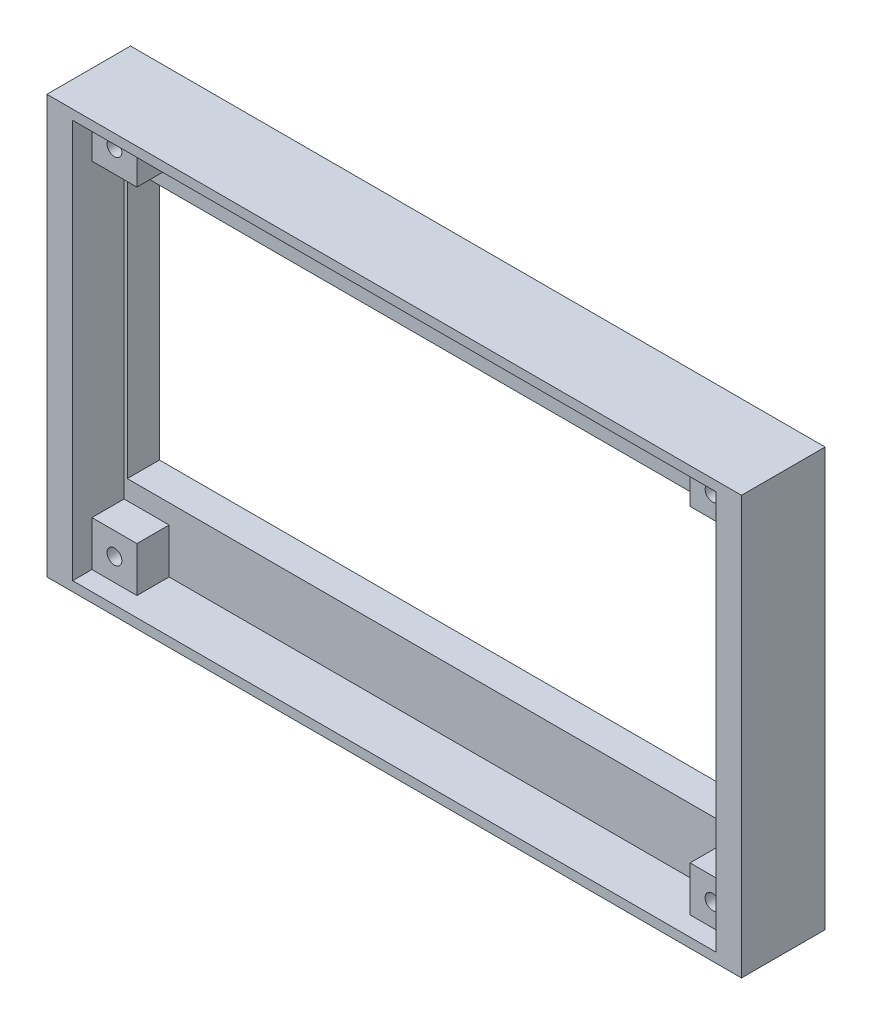
ISO-10303-21;
HEADER;
FILE_DESCRIPTION(('STEP AP214'),'2;1');
FILE_NAME('part.step','',(''),(''),'','','');
FILE_SCHEMA(('AUTOMOTIVE_DESIGN { 1 0 10303 214 1 1 1 1 }'));
ENDSEC;
DATA;
#1=APPLICATION_CONTEXT('core data for automotive mechanical design processes');
#2=APPLICATION_PROTOCOL_DEFINITION('international standard','automotive_design',2000,#1);
#3=PRODUCT_CONTEXT('',#1,'mechanical');
#4=PRODUCT('Part','Part','',(#3));
#5=PRODUCT_RELATED_PRODUCT_CATEGORY('part','',(#4));
#6=PRODUCT_DEFINITION_FORMATION('','',#4);
#7=PRODUCT_DEFINITION_CONTEXT('part definition',#1,'design');
#8=PRODUCT_DEFINITION('design','',#6,#7);
#9=PRODUCT_DEFINITION_SHAPE('','',#8);
#10=(LENGTH_UNIT() NAMED_UNIT(*) SI_UNIT(.MILLI.,.METRE.));
#11=(NAMED_UNIT(*) PLANE_ANGLE_UNIT() SI_UNIT($,.RADIAN.));
#12=(NAMED_UNIT(*) SI_UNIT($,.STERADIAN.) SOLID_ANGLE_UNIT());
#13=UNCERTAINTY_MEASURE_WITH_UNIT(LENGTH_MEASURE(1.E-05),#10,'distance_accuracy_value','');
#14=(GEOMETRIC_REPRESENTATION_CONTEXT(3) GLOBAL_UNCERTAINTY_ASSIGNED_CONTEXT((#13)) GLOBAL_UNIT_ASSIGNED_CONTEXT((#10,
#11,#12)) REPRESENTATION_CONTEXT('',''));
#15=CARTESIAN_POINT('',(0.,0.,0.));
#16=DIRECTION('',(0.,0.,1.));
#17=DIRECTION('',(1.,0.,0.));
#18=AXIS2_PLACEMENT_3D('',#15,#16,#17);
#19=CARTESIAN_POINT('',(0.,0.,10.));
#20=DIRECTION('',(0.,0.,1.));
#21=DIRECTION('',(1.,0.,0.));
#22=AXIS2_PLACEMENT_3D('',#19,#20,#21);
#23=PLANE('',#22);
#24=CARTESIAN_POINT('',(57.0752065679016,-33.9701789264413,10.));
#25=DIRECTION('',(0.,0.,1.));
#26=DIRECTION('',(1.,0.,0.));
#27=AXIS2_PLACEMENT_3D('',#24,#25,#26);
#28=CIRCLE('',#27,1.15);
#29=CARTESIAN_POINT('',(58.2252065679016,-33.9701789264413,10.));
#30=VERTEX_POINT('',#29);
#31=EDGE_CURVE('E558',#30,#30,#28,.T.);
#32=ORIENTED_EDGE('',*,*,#31,.F.);
#33=EDGE_LOOP('',(#32));
#34=FACE_BOUND('',#33,.T.);
#35=DIRECTION('',(0.,1.,0.));
#36=VECTOR('',#35,1.);
#37=CARTESIAN_POINT('',(53.5752065679016,0.,10.));
#38=LINE('',#37,#36);
#39=CARTESIAN_POINT('',(53.5752065679016,-37.4701789264413,10.));
#40=VERTEX_POINT('',#39);
#41=CARTESIAN_POINT('',(53.5752065679016,-30.4701789264413,10.));
#42=VERTEX_POINT('',#41);
#43=EDGE_CURVE('E290',#40,#42,#38,.T.);
#44=ORIENTED_EDGE('',*,*,#43,.F.);
#45=DIRECTION('',(1.,0.,0.));
#46=VECTOR('',#45,1.);
#47=CARTESIAN_POINT('',(0.,-37.4701789264413,10.));
#48=LINE('',#47,#46);
#49=CARTESIAN_POINT('',(60.5752065679016,-37.4701789264413,10.));
#50=VERTEX_POINT('',#49);
#51=EDGE_CURVE('E11',#40,#50,#48,.T.);
#52=ORIENTED_EDGE('',*,*,#51,.T.);
#53=DIRECTION('',(0.,1.,0.));
#54=VECTOR('',#53,1.);
#55=CARTESIAN_POINT('',(60.5752065679016,0.,10.));
#56=LINE('',#55,#54);
#57=CARTESIAN_POINT('',(60.5752065679016,-30.4701789264413,10.));
#58=VERTEX_POINT('',#57);
#59=EDGE_CURVE('E225',#50,#58,#56,.T.);
#60=ORIENTED_EDGE('',*,*,#59,.T.);
#61=DIRECTION('',(-1.,0.,0.));
#62=VECTOR('',#61,1.);
#63=CARTESIAN_POINT('',(0.,-30.4701789264413,10.));
#64=LINE('',#63,#62);
#65=EDGE_CURVE('E287',#58,#42,#64,.T.);
#66=ORIENTED_EDGE('',*,*,#65,.T.);
#67=EDGE_LOOP('',(#44,#52,#60,#66));
#68=FACE_BOUND('',#67,.T.);
#69=ADVANCED_FACE('F41',(#34,#68),#23,.T.);
#70=CARTESIAN_POINT('',(57.0752065679016,21.0298210735587,10.));
#71=DIRECTION('',(0.,0.,1.));
#72=DIRECTION('',(1.,0.,0.));
#73=AXIS2_PLACEMENT_3D('',#70,#71,#72);
#74=CIRCLE('',#73,1.15);
#75=CARTESIAN_POINT('',(58.2252065679016,21.0298210735587,10.));
#76=VERTEX_POINT('',#75);
#77=EDGE_CURVE('E572',#76,#76,#74,.T.);
#78=ORIENTED_EDGE('',*,*,#77,.F.);
#79=EDGE_LOOP('',(#78));
#80=FACE_BOUND('',#79,.T.);
#81=DIRECTION('',(-1.,0.,0.));
#82=VECTOR('',#81,1.);
#83=CARTESIAN_POINT('',(0.,17.5298210735587,10.));
#84=LINE('',#83,#82);
#85=CARTESIAN_POINT('',(60.5752065679016,17.5298210735587,10.));
#86=VERTEX_POINT('',#85);
#87=CARTESIAN_POINT('',(53.5752065679016,17.5298210735587,10.));
#88=VERTEX_POINT('',#87);
#89=EDGE_CURVE('E283',#86,#88,#84,.T.);
#90=ORIENTED_EDGE('',*,*,#89,.F.);
#91=CARTESIAN_POINT('',(60.5752065679016,24.5298210735587,10.));
#92=VERTEX_POINT('',#91);
#93=EDGE_CURVE('E51',#86,#92,#56,.T.);
#94=ORIENTED_EDGE('',*,*,#93,.T.);
#95=DIRECTION('',(-1.,0.,0.));
#96=VECTOR('',#95,1.);
#97=CARTESIAN_POINT('',(0.,24.5298210735587,10.));
#98=LINE('',#97,#96);
#99=CARTESIAN_POINT('',(53.5752065679016,24.5298210735587,10.));
#100=VERTEX_POINT('',#99);
#101=EDGE_CURVE('E261',#92,#100,#98,.T.);
#102=ORIENTED_EDGE('',*,*,#101,.T.);
#103=DIRECTION('',(0.,-1.,0.));
#104=VECTOR('',#103,1.);
#105=CARTESIAN_POINT('',(53.5752065679016,0.,10.));
#106=LINE('',#105,#104);
#107=EDGE_CURVE('E279',#100,#88,#106,.T.);
#108=ORIENTED_EDGE('',*,*,#107,.T.);
#109=EDGE_LOOP('',(#90,#94,#102,#108));
#110=FACE_BOUND('',#109,.T.);
#111=ADVANCED_FACE('F475',(#80,#110),#23,.T.);
#112=CARTESIAN_POINT('',(-35.9247934320984,21.0298210735587,10.));
#113=DIRECTION('',(0.,0.,1.));
#114=DIRECTION('',(1.,0.,0.));
#115=AXIS2_PLACEMENT_3D('',#112,#113,#114);
#116=CIRCLE('',#115,1.15);
#117=CARTESIAN_POINT('',(-34.7747934320984,21.0298210735587,10.));
#118=VERTEX_POINT('',#117);
#119=EDGE_CURVE('E564',#118,#118,#116,.T.);
#120=ORIENTED_EDGE('',*,*,#119,.F.);
#121=EDGE_LOOP('',(#120));
#122=FACE_BOUND('',#121,.T.);
#123=DIRECTION('',(0.,-1.,0.));
#124=VECTOR('',#123,1.);
#125=CARTESIAN_POINT('',(-32.4247934320984,0.,10.));
#126=LINE('',#125,#124);
#127=CARTESIAN_POINT('',(-32.4247934320984,24.5298210735587,10.));
#128=VERTEX_POINT('',#127);
#129=CARTESIAN_POINT('',(-32.4247934320984,17.5298210735587,10.));
#130=VERTEX_POINT('',#129);
#131=EDGE_CURVE('E275',#128,#130,#126,.T.);
#132=ORIENTED_EDGE('',*,*,#131,.F.);
#133=CARTESIAN_POINT('',(-39.4247934320984,24.5298210735587,10.));
#134=VERTEX_POINT('',#133);
#135=EDGE_CURVE('E265',#128,#134,#98,.T.);
#136=ORIENTED_EDGE('',*,*,#135,.T.);
#137=DIRECTION('',(0.,-1.,0.));
#138=VECTOR('',#137,1.);
#139=CARTESIAN_POINT('',(-39.4247934320984,0.,10.));
#140=LINE('',#139,#138);
#141=CARTESIAN_POINT('',(-39.4247934320984,17.5298210735587,10.));
#142=VERTEX_POINT('',#141);
#143=EDGE_CURVE('E257',#134,#142,#140,.T.);
#144=ORIENTED_EDGE('',*,*,#143,.T.);
#145=DIRECTION('',(1.,0.,0.));
#146=VECTOR('',#145,1.);
#147=CARTESIAN_POINT('',(0.,17.5298210735587,10.));
#148=LINE('',#147,#146);
#149=EDGE_CURVE('E301',#142,#130,#148,.T.);
#150=ORIENTED_EDGE('',*,*,#149,.T.);
#151=EDGE_LOOP('',(#132,#136,#144,#150));
#152=FACE_BOUND('',#151,.T.);
#153=ADVANCED_FACE('F512',(#122,#152),#23,.T.);
#154=CARTESIAN_POINT('',(-35.9247934320984,-33.9701789264413,10.));
#155=DIRECTION('',(0.,0.,1.));
#156=DIRECTION('',(1.,0.,0.));
#157=AXIS2_PLACEMENT_3D('',#154,#155,#156);
#158=CIRCLE('',#157,1.15);
#159=CARTESIAN_POINT('',(-34.7747934320984,-33.9701789264413,10.));
#160=VERTEX_POINT('',#159);
#161=EDGE_CURVE('E551',#160,#160,#158,.T.);
#162=ORIENTED_EDGE('',*,*,#161,.F.);
#163=EDGE_LOOP('',(#162));
#164=FACE_BOUND('',#163,.T.);
#165=CARTESIAN_POINT('',(-39.4247934320984,-30.4701789264413,10.));
#166=VERTEX_POINT('',#165);
#167=CARTESIAN_POINT('',(-39.4247934320984,-37.4701789264413,10.));
#168=VERTEX_POINT('',#167);
#169=EDGE_CURVE('E262',#166,#168,#140,.T.);
#170=ORIENTED_EDGE('',*,*,#169,.T.);
#171=CARTESIAN_POINT('',(-32.4247934320984,-37.4701789264413,10.));
#172=VERTEX_POINT('',#171);
#173=EDGE_CURVE('E53',#168,#172,#48,.T.);
#174=ORIENTED_EDGE('',*,*,#173,.T.);
#175=DIRECTION('',(0.,1.,0.));
#176=VECTOR('',#175,1.);
#177=CARTESIAN_POINT('',(-32.4247934320984,0.,10.));
#178=LINE('',#177,#176);
#179=CARTESIAN_POINT('',(-32.4247934320984,-30.4701789264413,10.));
#180=VERTEX_POINT('',#179);
#181=EDGE_CURVE('E294',#172,#180,#178,.T.);
#182=ORIENTED_EDGE('',*,*,#181,.T.);
#183=DIRECTION('',(1.,0.,0.));
#184=VECTOR('',#183,1.);
#185=CARTESIAN_POINT('',(0.,-30.4701789264413,10.));
#186=LINE('',#185,#184);
#187=EDGE_CURVE('E297',#166,#180,#186,.T.);
#188=ORIENTED_EDGE('',*,*,#187,.F.);
#189=EDGE_LOOP('',(#170,#174,#182,#188));
#190=FACE_BOUND('',#189,.T.);
#191=ADVANCED_FACE('F502',(#164,#190),#23,.T.);
#192=CARTESIAN_POINT('',(0.,0.,5.));
#193=DIRECTION('',(0.,0.,1.));
#194=DIRECTION('',(1.,0.,0.));
#195=AXIS2_PLACEMENT_3D('',#192,#193,#194);
#196=PLANE('',#195);
#197=DIRECTION('',(1.,0.,0.));
#198=VECTOR('',#197,1.);
#199=CARTESIAN_POINT('',(-38.9247934320984,-27.4701789264413,5.));
#200=LINE('',#199,#198);
#201=CARTESIAN_POINT('',(-38.9247934320984,-27.4701789264413,5.));
#202=VERTEX_POINT('',#201);
#203=CARTESIAN_POINT('',(60.0752065679016,-27.4701789264413,5.));
#204=VERTEX_POINT('',#203);
#205=EDGE_CURVE('E395',#202,#204,#200,.T.);
#206=ORIENTED_EDGE('',*,*,#205,.F.);
#207=DIRECTION('',(0.,-1.,0.));
#208=VECTOR('',#207,1.);
#209=CARTESIAN_POINT('',(-38.9247934320984,14.5298210735587,5.));
#210=LINE('',#209,#208);
#211=CARTESIAN_POINT('',(-38.9247934320984,14.5298210735587,5.));
#212=VERTEX_POINT('',#211);
#213=EDGE_CURVE('E392',#212,#202,#210,.T.);
#214=ORIENTED_EDGE('',*,*,#213,.F.);
#215=DIRECTION('',(-1.,0.,0.));
#216=VECTOR('',#215,1.);
#217=CARTESIAN_POINT('',(-38.9247934320984,14.5298210735587,5.));
#218=LINE('',#217,#216);
#219=CARTESIAN_POINT('',(60.0752065679016,14.5298210735587,5.));
#220=VERTEX_POINT('',#219);
#221=EDGE_CURVE('E403',#220,#212,#218,.T.);
#222=ORIENTED_EDGE('',*,*,#221,.F.);
#223=DIRECTION('',(0.,1.,0.));
#224=VECTOR('',#223,1.);
#225=CARTESIAN_POINT('',(60.0752065679016,14.5298210735587,5.));
#226=LINE('',#225,#224);
#227=EDGE_CURVE('E399',#204,#220,#226,.T.);
#228=ORIENTED_EDGE('',*,*,#227,.F.);
#229=EDGE_LOOP('',(#206,#214,#222,#228));
#230=FACE_BOUND('',#229,.T.);
#231=DIRECTION('',(1.,0.,0.));
#232=VECTOR('',#231,1.);
#233=CARTESIAN_POINT('',(0.,24.5298210735587,5.));
#234=LINE('',#233,#232);
#235=CARTESIAN_POINT('',(-32.4247934320984,24.5298210735587,5.));
#236=VERTEX_POINT('',#235);
#237=CARTESIAN_POINT('',(53.5752065679016,24.5298210735587,5.));
#238=VERTEX_POINT('',#237);
#239=EDGE_CURVE('E307',#236,#238,#234,.T.);
#240=ORIENTED_EDGE('',*,*,#239,.F.);
#241=DIRECTION('',(0.,-1.,0.));
#242=VECTOR('',#241,1.);
#243=CARTESIAN_POINT('',(-32.4247934320984,0.,5.));
#244=LINE('',#243,#242);
#245=CARTESIAN_POINT('',(-32.4247934320984,17.5298210735587,5.));
#246=VERTEX_POINT('',#245);
#247=EDGE_CURVE('E67',#236,#246,#244,.T.);
#248=ORIENTED_EDGE('',*,*,#247,.T.);
#249=DIRECTION('',(1.,0.,0.));
#250=VECTOR('',#249,1.);
#251=CARTESIAN_POINT('',(0.,17.5298210735587,5.));
#252=LINE('',#251,#250);
#253=CARTESIAN_POINT('',(-39.4247934320984,17.5298210735587,5.));
#254=VERTEX_POINT('',#253);
#255=EDGE_CURVE('E280',#254,#246,#252,.T.);
#256=ORIENTED_EDGE('',*,*,#255,.F.);
#257=DIRECTION('',(0.,-1.,0.));
#258=VECTOR('',#257,1.);
#259=CARTESIAN_POINT('',(-39.4247934320984,0.,5.));
#260=LINE('',#259,#258);
#261=CARTESIAN_POINT('',(-39.4247934320984,-30.4701789264413,5.));
#262=VERTEX_POINT('',#261);
#263=EDGE_CURVE('E339',#254,#262,#260,.T.);
#264=ORIENTED_EDGE('',*,*,#263,.T.);
#265=DIRECTION('',(1.,0.,0.));
#266=VECTOR('',#265,1.);
#267=CARTESIAN_POINT('',(0.,-30.4701789264413,5.));
#268=LINE('',#267,#266);
#269=CARTESIAN_POINT('',(-32.4247934320984,-30.4701789264413,5.));
#270=VERTEX_POINT('',#269);
#271=EDGE_CURVE('E336',#262,#270,#268,.T.);
#272=ORIENTED_EDGE('',*,*,#271,.T.);
#273=DIRECTION('',(0.,1.,0.));
#274=VECTOR('',#273,1.);
#275=CARTESIAN_POINT('',(-32.4247934320984,0.,5.));
#276=LINE('',#275,#274);
#277=CARTESIAN_POINT('',(-32.4247934320984,-37.4701789264413,5.));
#278=VERTEX_POINT('',#277);
#279=EDGE_CURVE('E332',#278,#270,#276,.T.);
#280=ORIENTED_EDGE('',*,*,#279,.F.);
#281=DIRECTION('',(1.,0.,0.));
#282=VECTOR('',#281,1.);
#283=CARTESIAN_POINT('',(0.,-37.4701789264413,5.));
#284=LINE('',#283,#282);
#285=CARTESIAN_POINT('',(53.5752065679016,-37.4701789264413,5.));
#286=VERTEX_POINT('',#285);
#287=EDGE_CURVE('E329',#278,#286,#284,.T.);
#288=ORIENTED_EDGE('',*,*,#287,.T.);
#289=DIRECTION('',(0.,1.,0.));
#290=VECTOR('',#289,1.);
#291=CARTESIAN_POINT('',(53.5752065679016,0.,5.));
#292=LINE('',#291,#290);
#293=CARTESIAN_POINT('',(53.5752065679016,-30.4701789264413,5.));
#294=VERTEX_POINT('',#293);
#295=EDGE_CURVE('E326',#286,#294,#292,.T.);
#296=ORIENTED_EDGE('',*,*,#295,.T.);
#297=DIRECTION('',(-1.,0.,0.));
#298=VECTOR('',#297,1.);
#299=CARTESIAN_POINT('',(0.,-30.4701789264413,5.));
#300=LINE('',#299,#298);
#301=CARTESIAN_POINT('',(60.5752065679016,-30.4701789264413,5.));
#302=VERTEX_POINT('',#301);
#303=EDGE_CURVE('E322',#302,#294,#300,.T.);
#304=ORIENTED_EDGE('',*,*,#303,.F.);
#305=DIRECTION('',(0.,-1.,0.));
#306=VECTOR('',#305,1.);
#307=CARTESIAN_POINT('',(60.5752065679016,0.,5.));
#308=LINE('',#307,#306);
#309=CARTESIAN_POINT('',(60.5752065679016,17.5298210735587,5.));
#310=VERTEX_POINT('',#309);
#311=EDGE_CURVE('E318',#310,#302,#308,.T.);
#312=ORIENTED_EDGE('',*,*,#311,.F.);
#313=DIRECTION('',(-1.,0.,0.));
#314=VECTOR('',#313,1.);
#315=CARTESIAN_POINT('',(0.,17.5298210735587,5.));
#316=LINE('',#315,#314);
#317=CARTESIAN_POINT('',(53.5752065679016,17.5298210735587,5.));
#318=VERTEX_POINT('',#317);
#319=EDGE_CURVE('E315',#310,#318,#316,.T.);
#320=ORIENTED_EDGE('',*,*,#319,.T.);
#321=DIRECTION('',(0.,-1.,0.));
#322=VECTOR('',#321,1.);
#323=CARTESIAN_POINT('',(53.5752065679016,0.,5.));
#324=LINE('',#323,#322);
#325=EDGE_CURVE('E311',#238,#318,#324,.T.);
#326=ORIENTED_EDGE('',*,*,#325,.F.);
#327=EDGE_LOOP('',(#240,#248,#256,#264,#272,#280,#288,#296,#304,#312,#320,#326));
#328=FACE_BOUND('',#327,.T.);
#329=ADVANCED_FACE('F485',(#230,#328),#196,.T.);
#330=CARTESIAN_POINT('',(0.,0.,0.));
#331=DIRECTION('',(0.,0.,1.));
#332=DIRECTION('',(1.,0.,0.));
#333=AXIS2_PLACEMENT_3D('',#330,#331,#332);
#334=PLANE('',#333);
#335=DIRECTION('',(0.,-1.,0.));
#336=VECTOR('',#335,1.);
#337=CARTESIAN_POINT('',(-43.4247934320984,26.0298210735587,0.));
#338=LINE('',#337,#336);
#339=CARTESIAN_POINT('',(-43.4247934320984,26.0298210735587,0.));
#340=VERTEX_POINT('',#339);
#341=CARTESIAN_POINT('',(-43.4247934320984,-38.9701789264413,0.));
#342=VERTEX_POINT('',#341);
#343=EDGE_CURVE('E434',#340,#342,#338,.T.);
#344=ORIENTED_EDGE('',*,*,#343,.F.);
#345=DIRECTION('',(-1.,0.,0.));
#346=VECTOR('',#345,1.);
#347=CARTESIAN_POINT('',(-43.4247934320984,26.0298210735587,0.));
#348=LINE('',#347,#346);
#349=CARTESIAN_POINT('',(64.5752065679016,26.0298210735587,0.));
#350=VERTEX_POINT('',#349);
#351=EDGE_CURVE('E444',#350,#340,#348,.T.);
#352=ORIENTED_EDGE('',*,*,#351,.F.);
#353=DIRECTION('',(0.,1.,0.));
#354=VECTOR('',#353,1.);
#355=CARTESIAN_POINT('',(64.5752065679016,26.0298210735587,0.));
#356=LINE('',#355,#354);
#357=CARTESIAN_POINT('',(64.5752065679016,-38.9701789264413,0.));
#358=VERTEX_POINT('',#357);
#359=EDGE_CURVE('E441',#358,#350,#356,.T.);
#360=ORIENTED_EDGE('',*,*,#359,.F.);
#361=DIRECTION('',(1.,0.,0.));
#362=VECTOR('',#361,1.);
#363=CARTESIAN_POINT('',(-43.4247934320984,-38.9701789264413,0.));
#364=LINE('',#363,#362);
#365=EDGE_CURVE('E438',#342,#358,#364,.T.);
#366=ORIENTED_EDGE('',*,*,#365,.F.);
#367=EDGE_LOOP('',(#344,#352,#360,#366));
#368=FACE_BOUND('',#367,.T.);
#369=DIRECTION('',(0.,-1.,0.));
#370=VECTOR('',#369,1.);
#371=CARTESIAN_POINT('',(-38.9247934320984,14.5298210735587,0.));
#372=LINE('',#371,#370);
#373=CARTESIAN_POINT('',(-38.9247934320984,14.5298210735587,0.));
#374=VERTEX_POINT('',#373);
#375=CARTESIAN_POINT('',(-38.9247934320984,-27.4701789264413,0.));
#376=VERTEX_POINT('',#375);
#377=EDGE_CURVE('E391',#374,#376,#372,.T.);
#378=ORIENTED_EDGE('',*,*,#377,.T.);
#379=DIRECTION('',(1.,0.,0.));
#380=VECTOR('',#379,1.);
#381=CARTESIAN_POINT('',(-38.9247934320984,-27.4701789264413,0.));
#382=LINE('',#381,#380);
#383=CARTESIAN_POINT('',(60.0752065679016,-27.4701789264413,0.));
#384=VERTEX_POINT('',#383);
#385=EDGE_CURVE('E410',#376,#384,#382,.T.);
#386=ORIENTED_EDGE('',*,*,#385,.T.);
#387=DIRECTION('',(0.,1.,0.));
#388=VECTOR('',#387,1.);
#389=CARTESIAN_POINT('',(60.0752065679016,14.5298210735587,0.));
#390=LINE('',#389,#388);
#391=CARTESIAN_POINT('',(60.0752065679016,14.5298210735587,0.));
#392=VERTEX_POINT('',#391);
#393=EDGE_CURVE('E414',#384,#392,#390,.T.);
#394=ORIENTED_EDGE('',*,*,#393,.T.);
#395=DIRECTION('',(-1.,0.,0.));
#396=VECTOR('',#395,1.);
#397=CARTESIAN_POINT('',(-38.9247934320984,14.5298210735587,0.));
#398=LINE('',#397,#396);
#399=EDGE_CURVE('E396',#392,#374,#398,.T.);
#400=ORIENTED_EDGE('',*,*,#399,.T.);
#401=EDGE_LOOP('',(#378,#386,#394,#400));
#402=FACE_BOUND('',#401,.T.);
#403=ADVANCED_FACE('F545',(#368,#402),#334,.F.);
#404=CARTESIAN_POINT('',(-43.4247934320984,26.0298210735587,5.));
#405=DIRECTION('',(1.,0.,0.));
#406=DIRECTION('',(0.,0.,-1.));
#407=AXIS2_PLACEMENT_3D('',#404,#405,#406);
#408=PLANE('',#407);
#409=ORIENTED_EDGE('',*,*,#343,.T.);
#410=DIRECTION('',(0.,0.,-1.));
#411=VECTOR('',#410,1.);
#412=CARTESIAN_POINT('',(-43.4247934320984,-38.9701789264413,5.));
#413=LINE('',#412,#411);
#414=CARTESIAN_POINT('',(-43.4247934320984,-38.9701789264413,13.));
#415=VERTEX_POINT('',#414);
#416=EDGE_CURVE('E45',#415,#342,#413,.T.);
#417=ORIENTED_EDGE('',*,*,#416,.F.);
#418=DIRECTION('',(0.,-1.,0.));
#419=VECTOR('',#418,1.);
#420=CARTESIAN_POINT('',(-43.4247934320984,0.,13.));
#421=LINE('',#420,#419);
#422=CARTESIAN_POINT('',(-43.4247934320984,26.0298210735587,13.));
#423=VERTEX_POINT('',#422);
#424=EDGE_CURVE('E247',#423,#415,#421,.T.);
#425=ORIENTED_EDGE('',*,*,#424,.F.);
#426=DIRECTION('',(0.,0.,-1.));
#427=VECTOR('',#426,1.);
#428=CARTESIAN_POINT('',(-43.4247934320984,26.0298210735587,5.));
#429=LINE('',#428,#427);
#430=EDGE_CURVE('E447',#423,#340,#429,.T.);
#431=ORIENTED_EDGE('',*,*,#430,.T.);
#432=EDGE_LOOP('',(#409,#417,#425,#431));
#433=FACE_BOUND('',#432,.T.);
#434=ADVANCED_FACE('F43',(#433),#408,.F.);
#435=CARTESIAN_POINT('',(-43.4247934320984,-38.9701789264413,5.));
#436=DIRECTION('',(0.,1.,0.));
#437=DIRECTION('',(0.,0.,1.));
#438=AXIS2_PLACEMENT_3D('',#435,#436,#437);
#439=PLANE('',#438);
#440=ORIENTED_EDGE('',*,*,#365,.T.);
#441=DIRECTION('',(0.,0.,-1.));
#442=VECTOR('',#441,1.);
#443=CARTESIAN_POINT('',(64.5752065679016,-38.9701789264413,5.));
#444=LINE('',#443,#442);
#445=CARTESIAN_POINT('',(64.5752065679016,-38.9701789264413,13.));
#446=VERTEX_POINT('',#445);
#447=EDGE_CURVE('E454',#446,#358,#444,.T.);
#448=ORIENTED_EDGE('',*,*,#447,.F.);
#449=DIRECTION('',(1.,0.,0.));
#450=VECTOR('',#449,1.);
#451=CARTESIAN_POINT('',(0.,-38.9701789264413,13.));
#452=LINE('',#451,#450);
#453=EDGE_CURVE('E251',#415,#446,#452,.T.);
#454=ORIENTED_EDGE('',*,*,#453,.F.);
#455=ORIENTED_EDGE('',*,*,#416,.T.);
#456=EDGE_LOOP('',(#440,#448,#454,#455));
#457=FACE_BOUND('',#456,.T.);
#458=ADVANCED_FACE('F805',(#457),#439,.F.);
#459=CARTESIAN_POINT('',(64.5752065679016,26.0298210735587,5.));
#460=DIRECTION('',(-1.,0.,0.));
#461=DIRECTION('',(0.,-1.,0.));
#462=AXIS2_PLACEMENT_3D('',#459,#460,#461);
#463=PLANE('',#462);
#464=ORIENTED_EDGE('',*,*,#359,.T.);
#465=DIRECTION('',(0.,0.,-1.));
#466=VECTOR('',#465,1.);
#467=CARTESIAN_POINT('',(64.5752065679016,26.0298210735587,5.));
#468=LINE('',#467,#466);
#469=CARTESIAN_POINT('',(64.5752065679016,26.0298210735587,13.));
#470=VERTEX_POINT('',#469);
#471=EDGE_CURVE('E451',#470,#350,#468,.T.);
#472=ORIENTED_EDGE('',*,*,#471,.F.);
#473=DIRECTION('',(0.,1.,0.));
#474=VECTOR('',#473,1.);
#475=CARTESIAN_POINT('',(64.5752065679016,0.,13.));
#476=LINE('',#475,#474);
#477=EDGE_CURVE('E239',#446,#470,#476,.T.);
#478=ORIENTED_EDGE('',*,*,#477,.F.);
#479=ORIENTED_EDGE('',*,*,#447,.T.);
#480=EDGE_LOOP('',(#464,#472,#478,#479));
#481=FACE_BOUND('',#480,.T.);
#482=ADVANCED_FACE('F819',(#481),#463,.F.);
#483=CARTESIAN_POINT('',(-43.4247934320984,26.0298210735587,5.));
#484=DIRECTION('',(0.,-1.,0.));
#485=DIRECTION('',(0.,0.,-1.));
#486=AXIS2_PLACEMENT_3D('',#483,#484,#485);
#487=PLANE('',#486);
#488=ORIENTED_EDGE('',*,*,#351,.T.);
#489=ORIENTED_EDGE('',*,*,#430,.F.);
#490=DIRECTION('',(-1.,0.,0.));
#491=VECTOR('',#490,1.);
#492=CARTESIAN_POINT('',(0.,26.0298210735587,13.));
#493=LINE('',#492,#491);
#494=EDGE_CURVE('E243',#470,#423,#493,.T.);
#495=ORIENTED_EDGE('',*,*,#494,.F.);
#496=ORIENTED_EDGE('',*,*,#471,.T.);
#497=EDGE_LOOP('',(#488,#489,#495,#496));
#498=FACE_BOUND('',#497,.T.);
#499=ADVANCED_FACE('F830',(#498),#487,.F.);
#500=CARTESIAN_POINT('',(-38.9247934320984,14.5298210735587,5.));
#501=DIRECTION('',(1.,0.,0.));
#502=DIRECTION('',(0.,0.,-1.));
#503=AXIS2_PLACEMENT_3D('',#500,#501,#502);
#504=PLANE('',#503);
#505=ORIENTED_EDGE('',*,*,#377,.F.);
#506=DIRECTION('',(0.,0.,-1.));
#507=VECTOR('',#506,1.);
#508=CARTESIAN_POINT('',(-38.9247934320984,14.5298210735587,5.));
#509=LINE('',#508,#507);
#510=EDGE_CURVE('E406',#212,#374,#509,.T.);
#511=ORIENTED_EDGE('',*,*,#510,.F.);
#512=ORIENTED_EDGE('',*,*,#213,.T.);
#513=DIRECTION('',(0.,0.,-1.));
#514=VECTOR('',#513,1.);
#515=CARTESIAN_POINT('',(-38.9247934320984,-27.4701789264413,5.));
#516=LINE('',#515,#514);
#517=EDGE_CURVE('E430',#202,#376,#516,.T.);
#518=ORIENTED_EDGE('',*,*,#517,.T.);
#519=EDGE_LOOP('',(#505,#511,#512,#518));
#520=FACE_BOUND('',#519,.T.);
#521=ADVANCED_FACE('F842',(#520),#504,.T.);
#522=CARTESIAN_POINT('',(-38.9247934320984,-27.4701789264413,5.));
#523=DIRECTION('',(0.,1.,0.));
#524=DIRECTION('',(0.,0.,1.));
#525=AXIS2_PLACEMENT_3D('',#522,#523,#524);
#526=PLANE('',#525);
#527=ORIENTED_EDGE('',*,*,#385,.F.);
#528=ORIENTED_EDGE('',*,*,#517,.F.);
#529=ORIENTED_EDGE('',*,*,#205,.T.);
#530=DIRECTION('',(0.,0.,-1.));
#531=VECTOR('',#530,1.);
#532=CARTESIAN_POINT('',(60.0752065679016,-27.4701789264413,5.));
#533=LINE('',#532,#531);
#534=EDGE_CURVE('E427',#204,#384,#533,.T.);
#535=ORIENTED_EDGE('',*,*,#534,.T.);
#536=EDGE_LOOP('',(#527,#528,#529,#535));
#537=FACE_BOUND('',#536,.T.);
#538=ADVANCED_FACE('F961',(#537),#526,.T.);
#539=CARTESIAN_POINT('',(60.0752065679016,14.5298210735587,5.));
#540=DIRECTION('',(-1.,0.,0.));
#541=DIRECTION('',(0.,0.,1.));
#542=AXIS2_PLACEMENT_3D('',#539,#540,#541);
#543=PLANE('',#542);
#544=ORIENTED_EDGE('',*,*,#393,.F.);
#545=ORIENTED_EDGE('',*,*,#534,.F.);
#546=ORIENTED_EDGE('',*,*,#227,.T.);
#547=DIRECTION('',(0.,0.,-1.));
#548=VECTOR('',#547,1.);
#549=CARTESIAN_POINT('',(60.0752065679016,14.5298210735587,5.));
#550=LINE('',#549,#548);
#551=EDGE_CURVE('E424',#220,#392,#550,.T.);
#552=ORIENTED_EDGE('',*,*,#551,.T.);
#553=EDGE_LOOP('',(#544,#545,#546,#552));
#554=FACE_BOUND('',#553,.T.);
#555=ADVANCED_FACE('F953',(#554),#543,.T.);
#556=CARTESIAN_POINT('',(-38.9247934320984,14.5298210735587,5.));
#557=DIRECTION('',(0.,-1.,0.));
#558=DIRECTION('',(0.,0.,-1.));
#559=AXIS2_PLACEMENT_3D('',#556,#557,#558);
#560=PLANE('',#559);
#561=ORIENTED_EDGE('',*,*,#399,.F.);
#562=ORIENTED_EDGE('',*,*,#551,.F.);
#563=ORIENTED_EDGE('',*,*,#221,.T.);
#564=ORIENTED_EDGE('',*,*,#510,.T.);
#565=EDGE_LOOP('',(#561,#562,#563,#564));
#566=FACE_BOUND('',#565,.T.);
#567=ADVANCED_FACE('F943',(#566),#560,.T.);
#568=CARTESIAN_POINT('',(-32.4247934320984,0.,10.));
#569=DIRECTION('',(1.,0.,0.));
#570=DIRECTION('',(0.,0.,-1.));
#571=AXIS2_PLACEMENT_3D('',#568,#569,#570);
#572=PLANE('',#571);
#573=ORIENTED_EDGE('',*,*,#247,.F.);
#574=DIRECTION('',(0.,0.,-1.));
#575=VECTOR('',#574,1.);
#576=CARTESIAN_POINT('',(-32.4247934320984,24.5298210735587,10.));
#577=LINE('',#576,#575);
#578=EDGE_CURVE('E387',#128,#236,#577,.T.);
#579=ORIENTED_EDGE('',*,*,#578,.F.);
#580=ORIENTED_EDGE('',*,*,#131,.T.);
#581=DIRECTION('',(0.,0.,-1.));
#582=VECTOR('',#581,1.);
#583=CARTESIAN_POINT('',(-32.4247934320984,17.5298210735587,10.));
#584=LINE('',#583,#582);
#585=EDGE_CURVE('E304',#130,#246,#584,.T.);
#586=ORIENTED_EDGE('',*,*,#585,.T.);
#587=EDGE_LOOP('',(#573,#579,#580,#586));
#588=FACE_BOUND('',#587,.T.);
#589=ADVANCED_FACE('F515',(#588),#572,.T.);
#590=CARTESIAN_POINT('',(0.,24.5298210735587,10.));
#591=DIRECTION('',(0.,1.,0.));
#592=DIRECTION('',(0.,0.,1.));
#593=AXIS2_PLACEMENT_3D('',#590,#591,#592);
#594=PLANE('',#593);
#595=ORIENTED_EDGE('',*,*,#239,.T.);
#596=DIRECTION('',(0.,0.,-1.));
#597=VECTOR('',#596,1.);
#598=CARTESIAN_POINT('',(53.5752065679016,24.5298210735587,10.));
#599=LINE('',#598,#597);
#600=EDGE_CURVE('E383',#100,#238,#599,.T.);
#601=ORIENTED_EDGE('',*,*,#600,.F.);
#602=ORIENTED_EDGE('',*,*,#101,.F.);
#603=DIRECTION('',(0.,0.,-1.));
#604=VECTOR('',#603,1.);
#605=CARTESIAN_POINT('',(60.5752065679016,24.5298210735587,13.));
#606=LINE('',#605,#604);
#607=CARTESIAN_POINT('',(60.5752065679016,24.5298210735587,13.));
#608=VERTEX_POINT('',#607);
#609=EDGE_CURVE('E270',#608,#92,#606,.T.);
#610=ORIENTED_EDGE('',*,*,#609,.F.);
#611=DIRECTION('',(-1.,0.,0.));
#612=VECTOR('',#611,1.);
#613=CARTESIAN_POINT('',(0.,24.5298210735587,13.));
#614=LINE('',#613,#612);
#615=CARTESIAN_POINT('',(-39.4247934320984,24.5298210735587,13.));
#616=VERTEX_POINT('',#615);
#617=EDGE_CURVE('E231',#608,#616,#614,.T.);
#618=ORIENTED_EDGE('',*,*,#617,.T.);
#619=DIRECTION('',(0.,0.,-1.));
#620=VECTOR('',#619,1.);
#621=CARTESIAN_POINT('',(-39.4247934320984,24.5298210735587,13.));
#622=LINE('',#621,#620);
#623=EDGE_CURVE('E213',#616,#134,#622,.T.);
#624=ORIENTED_EDGE('',*,*,#623,.T.);
#625=ORIENTED_EDGE('',*,*,#135,.F.);
#626=ORIENTED_EDGE('',*,*,#578,.T.);
#627=EDGE_LOOP('',(#595,#601,#602,#610,#618,#624,#625,#626));
#628=FACE_BOUND('',#627,.T.);
#629=ADVANCED_FACE('F517',(#628),#594,.F.);
#630=CARTESIAN_POINT('',(53.5752065679016,0.,10.));
#631=DIRECTION('',(1.,0.,0.));
#632=DIRECTION('',(0.,0.,-1.));
#633=AXIS2_PLACEMENT_3D('',#630,#631,#632);
#634=PLANE('',#633);
#635=ORIENTED_EDGE('',*,*,#325,.T.);
#636=DIRECTION('',(0.,0.,-1.));
#637=VECTOR('',#636,1.);
#638=CARTESIAN_POINT('',(53.5752065679016,17.5298210735587,10.));
#639=LINE('',#638,#637);
#640=EDGE_CURVE('E379',#88,#318,#639,.T.);
#641=ORIENTED_EDGE('',*,*,#640,.F.);
#642=ORIENTED_EDGE('',*,*,#107,.F.);
#643=ORIENTED_EDGE('',*,*,#600,.T.);
#644=EDGE_LOOP('',(#635,#641,#642,#643));
#645=FACE_BOUND('',#644,.T.);
#646=ADVANCED_FACE('F520',(#645),#634,.F.);
#647=CARTESIAN_POINT('',(0.,17.5298210735587,10.));
#648=DIRECTION('',(0.,-1.,0.));
#649=DIRECTION('',(0.,0.,-1.));
#650=AXIS2_PLACEMENT_3D('',#647,#648,#649);
#651=PLANE('',#650);
#652=ORIENTED_EDGE('',*,*,#319,.F.);
#653=DIRECTION('',(0.,0.,-1.));
#654=VECTOR('',#653,1.);
#655=CARTESIAN_POINT('',(60.5752065679016,17.5298210735587,10.));
#656=LINE('',#655,#654);
#657=EDGE_CURVE('E375',#86,#310,#656,.T.);
#658=ORIENTED_EDGE('',*,*,#657,.F.);
#659=ORIENTED_EDGE('',*,*,#89,.T.);
#660=ORIENTED_EDGE('',*,*,#640,.T.);
#661=EDGE_LOOP('',(#652,#658,#659,#660));
#662=FACE_BOUND('',#661,.T.);
#663=ADVANCED_FACE('F483',(#662),#651,.T.);
#664=CARTESIAN_POINT('',(60.5752065679016,0.,10.));
#665=DIRECTION('',(1.,0.,0.));
#666=DIRECTION('',(0.,1.,0.));
#667=AXIS2_PLACEMENT_3D('',#664,#665,#666);
#668=PLANE('',#667);
#669=ORIENTED_EDGE('',*,*,#311,.T.);
#670=DIRECTION('',(0.,0.,-1.));
#671=VECTOR('',#670,1.);
#672=CARTESIAN_POINT('',(60.5752065679016,-30.4701789264413,10.));
#673=LINE('',#672,#671);
#674=EDGE_CURVE('E371',#58,#302,#673,.T.);
#675=ORIENTED_EDGE('',*,*,#674,.F.);
#676=ORIENTED_EDGE('',*,*,#59,.F.);
#677=DIRECTION('',(0.,0.,-1.));
#678=VECTOR('',#677,1.);
#679=CARTESIAN_POINT('',(60.5752065679016,-37.4701789264413,13.));
#680=LINE('',#679,#678);
#681=CARTESIAN_POINT('',(60.5752065679016,-37.4701789264413,13.));
#682=VERTEX_POINT('',#681);
#683=EDGE_CURVE('E254',#682,#50,#680,.T.);
#684=ORIENTED_EDGE('',*,*,#683,.F.);
#685=DIRECTION('',(0.,1.,0.));
#686=VECTOR('',#685,1.);
#687=CARTESIAN_POINT('',(60.5752065679016,0.,13.));
#688=LINE('',#687,#686);
#689=EDGE_CURVE('E223',#682,#608,#688,.T.);
#690=ORIENTED_EDGE('',*,*,#689,.T.);
#691=ORIENTED_EDGE('',*,*,#609,.T.);
#692=ORIENTED_EDGE('',*,*,#93,.F.);
#693=ORIENTED_EDGE('',*,*,#657,.T.);
#694=EDGE_LOOP('',(#669,#675,#676,#684,#690,#691,#692,#693));
#695=FACE_BOUND('',#694,.T.);
#696=ADVANCED_FACE('F480',(#695),#668,.F.);
#697=CARTESIAN_POINT('',(0.,-30.4701789264413,10.));
#698=DIRECTION('',(0.,-1.,0.));
#699=DIRECTION('',(0.,0.,-1.));
#700=AXIS2_PLACEMENT_3D('',#697,#698,#699);
#701=PLANE('',#700);
#702=ORIENTED_EDGE('',*,*,#303,.T.);
#703=DIRECTION('',(0.,0.,-1.));
#704=VECTOR('',#703,1.);
#705=CARTESIAN_POINT('',(53.5752065679016,-30.4701789264413,10.));
#706=LINE('',#705,#704);
#707=EDGE_CURVE('E367',#42,#294,#706,.T.);
#708=ORIENTED_EDGE('',*,*,#707,.F.);
#709=ORIENTED_EDGE('',*,*,#65,.F.);
#710=ORIENTED_EDGE('',*,*,#674,.T.);
#711=EDGE_LOOP('',(#702,#708,#709,#710));
#712=FACE_BOUND('',#711,.T.);
#713=ADVANCED_FACE('F490',(#712),#701,.F.);
#714=CARTESIAN_POINT('',(53.5752065679016,0.,10.));
#715=DIRECTION('',(-1.,0.,0.));
#716=DIRECTION('',(0.,-1.,0.));
#717=AXIS2_PLACEMENT_3D('',#714,#715,#716);
#718=PLANE('',#717);
#719=ORIENTED_EDGE('',*,*,#295,.F.);
#720=DIRECTION('',(0.,0.,-1.));
#721=VECTOR('',#720,1.);
#722=CARTESIAN_POINT('',(53.5752065679016,-37.4701789264413,10.));
#723=LINE('',#722,#721);
#724=EDGE_CURVE('E363',#40,#286,#723,.T.);
#725=ORIENTED_EDGE('',*,*,#724,.F.);
#726=ORIENTED_EDGE('',*,*,#43,.T.);
#727=ORIENTED_EDGE('',*,*,#707,.T.);
#728=EDGE_LOOP('',(#719,#725,#726,#727));
#729=FACE_BOUND('',#728,.T.);
#730=ADVANCED_FACE('F497',(#729),#718,.T.);
#731=CARTESIAN_POINT('',(0.,-37.4701789264413,10.));
#732=DIRECTION('',(0.,1.,0.));
#733=DIRECTION('',(0.,0.,1.));
#734=AXIS2_PLACEMENT_3D('',#731,#732,#733);
#735=PLANE('',#734);
#736=ORIENTED_EDGE('',*,*,#287,.F.);
#737=DIRECTION('',(0.,0.,-1.));
#738=VECTOR('',#737,1.);
#739=CARTESIAN_POINT('',(-32.4247934320984,-37.4701789264413,10.));
#740=LINE('',#739,#738);
#741=EDGE_CURVE('E359',#172,#278,#740,.T.);
#742=ORIENTED_EDGE('',*,*,#741,.F.);
#743=ORIENTED_EDGE('',*,*,#173,.F.);
#744=DIRECTION('',(0.,0.,-1.));
#745=VECTOR('',#744,1.);
#746=CARTESIAN_POINT('',(-39.4247934320984,-37.4701789264413,13.));
#747=LINE('',#746,#745);
#748=CARTESIAN_POINT('',(-39.4247934320984,-37.4701789264413,13.));
#749=VERTEX_POINT('',#748);
#750=EDGE_CURVE('E203',#749,#168,#747,.T.);
#751=ORIENTED_EDGE('',*,*,#750,.F.);
#752=DIRECTION('',(1.,0.,0.));
#753=VECTOR('',#752,1.);
#754=CARTESIAN_POINT('',(0.,-37.4701789264413,13.));
#755=LINE('',#754,#753);
#756=EDGE_CURVE('E207',#749,#682,#755,.T.);
#757=ORIENTED_EDGE('',*,*,#756,.T.);
#758=ORIENTED_EDGE('',*,*,#683,.T.);
#759=ORIENTED_EDGE('',*,*,#51,.F.);
#760=ORIENTED_EDGE('',*,*,#724,.T.);
#761=EDGE_LOOP('',(#736,#742,#743,#751,#757,#758,#759,#760));
#762=FACE_BOUND('',#761,.T.);
#763=ADVANCED_FACE('F206',(#762),#735,.T.);
#764=CARTESIAN_POINT('',(-32.4247934320984,0.,10.));
#765=DIRECTION('',(-1.,0.,0.));
#766=DIRECTION('',(0.,0.,1.));
#767=AXIS2_PLACEMENT_3D('',#764,#765,#766);
#768=PLANE('',#767);
#769=ORIENTED_EDGE('',*,*,#279,.T.);
#770=DIRECTION('',(0.,0.,-1.));
#771=VECTOR('',#770,1.);
#772=CARTESIAN_POINT('',(-32.4247934320984,-30.4701789264413,10.));
#773=LINE('',#772,#771);
#774=EDGE_CURVE('E355',#180,#270,#773,.T.);
#775=ORIENTED_EDGE('',*,*,#774,.F.);
#776=ORIENTED_EDGE('',*,*,#181,.F.);
#777=ORIENTED_EDGE('',*,*,#741,.T.);
#778=EDGE_LOOP('',(#769,#775,#776,#777));
#779=FACE_BOUND('',#778,.T.);
#780=ADVANCED_FACE('F501',(#779),#768,.F.);
#781=CARTESIAN_POINT('',(0.,-30.4701789264413,10.));
#782=DIRECTION('',(0.,1.,0.));
#783=DIRECTION('',(0.,0.,1.));
#784=AXIS2_PLACEMENT_3D('',#781,#782,#783);
#785=PLANE('',#784);
#786=ORIENTED_EDGE('',*,*,#271,.F.);
#787=DIRECTION('',(0.,0.,-1.));
#788=VECTOR('',#787,1.);
#789=CARTESIAN_POINT('',(-39.4247934320984,-30.4701789264413,10.));
#790=LINE('',#789,#788);
#791=EDGE_CURVE('E351',#166,#262,#790,.T.);
#792=ORIENTED_EDGE('',*,*,#791,.F.);
#793=ORIENTED_EDGE('',*,*,#187,.T.);
#794=ORIENTED_EDGE('',*,*,#774,.T.);
#795=EDGE_LOOP('',(#786,#792,#793,#794));
#796=FACE_BOUND('',#795,.T.);
#797=ADVANCED_FACE('F506',(#796),#785,.T.);
#798=CARTESIAN_POINT('',(-39.4247934320984,0.,10.));
#799=DIRECTION('',(1.,0.,0.));
#800=DIRECTION('',(0.,1.,0.));
#801=AXIS2_PLACEMENT_3D('',#798,#799,#800);
#802=PLANE('',#801);
#803=ORIENTED_EDGE('',*,*,#263,.F.);
#804=DIRECTION('',(0.,0.,-1.));
#805=VECTOR('',#804,1.);
#806=CARTESIAN_POINT('',(-39.4247934320984,17.5298210735587,10.));
#807=LINE('',#806,#805);
#808=EDGE_CURVE('E347',#142,#254,#807,.T.);
#809=ORIENTED_EDGE('',*,*,#808,.F.);
#810=ORIENTED_EDGE('',*,*,#143,.F.);
#811=ORIENTED_EDGE('',*,*,#623,.F.);
#812=DIRECTION('',(0.,-1.,0.));
#813=VECTOR('',#812,1.);
#814=CARTESIAN_POINT('',(-39.4247934320984,0.,13.));
#815=LINE('',#814,#813);
#816=EDGE_CURVE('E220',#616,#749,#815,.T.);
#817=ORIENTED_EDGE('',*,*,#816,.T.);
#818=ORIENTED_EDGE('',*,*,#750,.T.);
#819=ORIENTED_EDGE('',*,*,#169,.F.);
#820=ORIENTED_EDGE('',*,*,#791,.T.);
#821=EDGE_LOOP('',(#803,#809,#810,#811,#817,#818,#819,#820));
#822=FACE_BOUND('',#821,.T.);
#823=ADVANCED_FACE('F228',(#822),#802,.T.);
#824=CARTESIAN_POINT('',(0.,17.5298210735587,10.));
#825=DIRECTION('',(0.,1.,0.));
#826=DIRECTION('',(0.,0.,1.));
#827=AXIS2_PLACEMENT_3D('',#824,#825,#826);
#828=PLANE('',#827);
#829=ORIENTED_EDGE('',*,*,#255,.T.);
#830=ORIENTED_EDGE('',*,*,#585,.F.);
#831=ORIENTED_EDGE('',*,*,#149,.F.);
#832=ORIENTED_EDGE('',*,*,#808,.T.);
#833=EDGE_LOOP('',(#829,#830,#831,#832));
#834=FACE_BOUND('',#833,.T.);
#835=ADVANCED_FACE('F511',(#834),#828,.F.);
#836=CARTESIAN_POINT('',(0.,0.,13.));
#837=DIRECTION('',(0.,0.,1.));
#838=DIRECTION('',(1.,0.,0.));
#839=AXIS2_PLACEMENT_3D('',#836,#837,#838);
#840=PLANE('',#839);
#841=ORIENTED_EDGE('',*,*,#756,.F.);
#842=ORIENTED_EDGE('',*,*,#816,.F.);
#843=ORIENTED_EDGE('',*,*,#617,.F.);
#844=ORIENTED_EDGE('',*,*,#689,.F.);
#845=EDGE_LOOP('',(#841,#842,#843,#844));
#846=FACE_BOUND('',#845,.T.);
#847=ORIENTED_EDGE('',*,*,#477,.T.);
#848=ORIENTED_EDGE('',*,*,#494,.T.);
#849=ORIENTED_EDGE('',*,*,#424,.T.);
#850=ORIENTED_EDGE('',*,*,#453,.T.);
#851=EDGE_LOOP('',(#847,#848,#849,#850));
#852=FACE_BOUND('',#851,.T.);
#853=ADVANCED_FACE('F217',(#846,#852),#840,.T.);
#854=CARTESIAN_POINT('',(-35.9247934320984,-33.9701789264413,3.));
#855=DIRECTION('',(0.,0.,1.));
#856=DIRECTION('',(1.,0.,0.));
#857=AXIS2_PLACEMENT_3D('',#854,#855,#856);
#858=CYLINDRICAL_SURFACE('',#857,1.15);
#859=CARTESIAN_POINT('',(-35.9247934320984,-33.9701789264413,3.));
#860=DIRECTION('',(0.,0.,1.));
#861=DIRECTION('',(1.,0.,0.));
#862=AXIS2_PLACEMENT_3D('',#859,#860,#861);
#863=CIRCLE('',#862,1.15);
#864=CARTESIAN_POINT('',(-34.7747934320984,-33.9701789264413,3.));
#865=VERTEX_POINT('',#864);
#866=EDGE_CURVE('E554',#865,#865,#863,.T.);
#867=ORIENTED_EDGE('',*,*,#866,.F.);
#868=EDGE_LOOP('',(#867));
#869=FACE_BOUND('',#868,.T.);
#870=ORIENTED_EDGE('',*,*,#161,.T.);
#871=EDGE_LOOP('',(#870));
#872=FACE_BOUND('',#871,.T.);
#873=ADVANCED_FACE('F607',(#869,#872),#858,.F.);
#874=CARTESIAN_POINT('',(-35.9247934320984,-33.9701789264413,3.));
#875=DIRECTION('',(0.,0.,1.));
#876=DIRECTION('',(1.,0.,0.));
#877=AXIS2_PLACEMENT_3D('',#874,#875,#876);
#878=PLANE('',#877);
#879=ORIENTED_EDGE('',*,*,#866,.T.);
#880=EDGE_LOOP('',(#879));
#881=FACE_BOUND('',#880,.T.);
#882=ADVANCED_FACE('F603',(#881),#878,.T.);
#883=CARTESIAN_POINT('',(-35.9247934320984,21.0298210735587,3.));
#884=DIRECTION('',(0.,0.,1.));
#885=DIRECTION('',(1.,0.,0.));
#886=AXIS2_PLACEMENT_3D('',#883,#884,#885);
#887=CYLINDRICAL_SURFACE('',#886,1.15);
#888=CARTESIAN_POINT('',(-35.9247934320984,21.0298210735587,3.));
#889=DIRECTION('',(0.,0.,1.));
#890=DIRECTION('',(1.,0.,0.));
#891=AXIS2_PLACEMENT_3D('',#888,#889,#890);
#892=CIRCLE('',#891,1.15);
#893=CARTESIAN_POINT('',(-34.7747934320984,21.0298210735587,3.));
#894=VERTEX_POINT('',#893);
#895=EDGE_CURVE('E258',#894,#894,#892,.T.);
#896=ORIENTED_EDGE('',*,*,#895,.F.);
#897=EDGE_LOOP('',(#896));
#898=FACE_BOUND('',#897,.T.);
#899=ORIENTED_EDGE('',*,*,#119,.T.);
#900=EDGE_LOOP('',(#899));
#901=FACE_BOUND('',#900,.T.);
#902=ADVANCED_FACE('F606',(#898,#901),#887,.F.);
#903=CARTESIAN_POINT('',(-35.9247934320984,21.0298210735587,3.));
#904=DIRECTION('',(0.,0.,1.));
#905=DIRECTION('',(1.,0.,0.));
#906=AXIS2_PLACEMENT_3D('',#903,#904,#905);
#907=PLANE('',#906);
#908=ORIENTED_EDGE('',*,*,#895,.T.);
#909=EDGE_LOOP('',(#908));
#910=FACE_BOUND('',#909,.T.);
#911=ADVANCED_FACE('F612',(#910),#907,.T.);
#912=CARTESIAN_POINT('',(57.0752065679016,21.0298210735587,3.));
#913=DIRECTION('',(0.,0.,1.));
#914=DIRECTION('',(1.,0.,0.));
#915=AXIS2_PLACEMENT_3D('',#912,#913,#914);
#916=CYLINDRICAL_SURFACE('',#915,1.15);
#917=CARTESIAN_POINT('',(57.0752065679016,21.0298210735587,3.));
#918=DIRECTION('',(0.,0.,1.));
#919=DIRECTION('',(1.,0.,0.));
#920=AXIS2_PLACEMENT_3D('',#917,#918,#919);
#921=CIRCLE('',#920,1.15);
#922=CARTESIAN_POINT('',(58.2252065679016,21.0298210735587,3.));
#923=VERTEX_POINT('',#922);
#924=EDGE_CURVE('E567',#923,#923,#921,.T.);
#925=ORIENTED_EDGE('',*,*,#924,.F.);
#926=EDGE_LOOP('',(#925));
#927=FACE_BOUND('',#926,.T.);
#928=ORIENTED_EDGE('',*,*,#77,.T.);
#929=EDGE_LOOP('',(#928));
#930=FACE_BOUND('',#929,.T.);
#931=ADVANCED_FACE('F598',(#927,#930),#916,.F.);
#932=CARTESIAN_POINT('',(57.0752065679016,21.0298210735587,3.));
#933=DIRECTION('',(0.,0.,1.));
#934=DIRECTION('',(1.,0.,0.));
#935=AXIS2_PLACEMENT_3D('',#932,#933,#934);
#936=PLANE('',#935);
#937=ORIENTED_EDGE('',*,*,#924,.T.);
#938=EDGE_LOOP('',(#937));
#939=FACE_BOUND('',#938,.T.);
#940=ADVANCED_FACE('F589',(#939),#936,.T.);
#941=CARTESIAN_POINT('',(57.0752065679016,-33.9701789264413,3.));
#942=DIRECTION('',(0.,0.,1.));
#943=DIRECTION('',(1.,0.,0.));
#944=AXIS2_PLACEMENT_3D('',#941,#942,#943);
#945=CYLINDRICAL_SURFACE('',#944,1.15);
#946=CARTESIAN_POINT('',(57.0752065679016,-33.9701789264413,3.));
#947=DIRECTION('',(0.,0.,1.));
#948=DIRECTION('',(1.,0.,0.));
#949=AXIS2_PLACEMENT_3D('',#946,#947,#948);
#950=CIRCLE('',#949,1.15);
#951=CARTESIAN_POINT('',(58.2252065679016,-33.9701789264413,3.));
#952=VERTEX_POINT('',#951);
#953=EDGE_CURVE('E578',#952,#952,#950,.T.);
#954=ORIENTED_EDGE('',*,*,#953,.F.);
#955=EDGE_LOOP('',(#954));
#956=FACE_BOUND('',#955,.T.);
#957=ORIENTED_EDGE('',*,*,#31,.T.);
#958=EDGE_LOOP('',(#957));
#959=FACE_BOUND('',#958,.T.);
#960=ADVANCED_FACE('F586',(#956,#959),#945,.F.);
#961=CARTESIAN_POINT('',(57.0752065679016,-33.9701789264413,3.));
#962=DIRECTION('',(0.,0.,1.));
#963=DIRECTION('',(1.,0.,0.));
#964=AXIS2_PLACEMENT_3D('',#961,#962,#963);
#965=PLANE('',#964);
#966=ORIENTED_EDGE('',*,*,#953,.T.);
#967=EDGE_LOOP('',(#966));
#968=FACE_BOUND('',#967,.T.);
#969=ADVANCED_FACE('F588',(#968),#965,.T.);
#970=CLOSED_SHELL('',(#69,#111,#153,#191,#329,#403,#434,#458,#482,#499,#521,#538,#555,#567,#589,
#629,#646,#663,#696,#713,#730,#763,#780,#797,#823,#835,#853,#873,#882,#902,#911,#931,#940,#960,#969));
#971=MANIFOLD_SOLID_BREP('B2',#970);
#972=ADVANCED_BREP_SHAPE_REPRESENTATION('',(#18,#971),#14);
#973=SHAPE_DEFINITION_REPRESENTATION(#9,#972);
ENDSEC;
END-ISO-10303-21;
